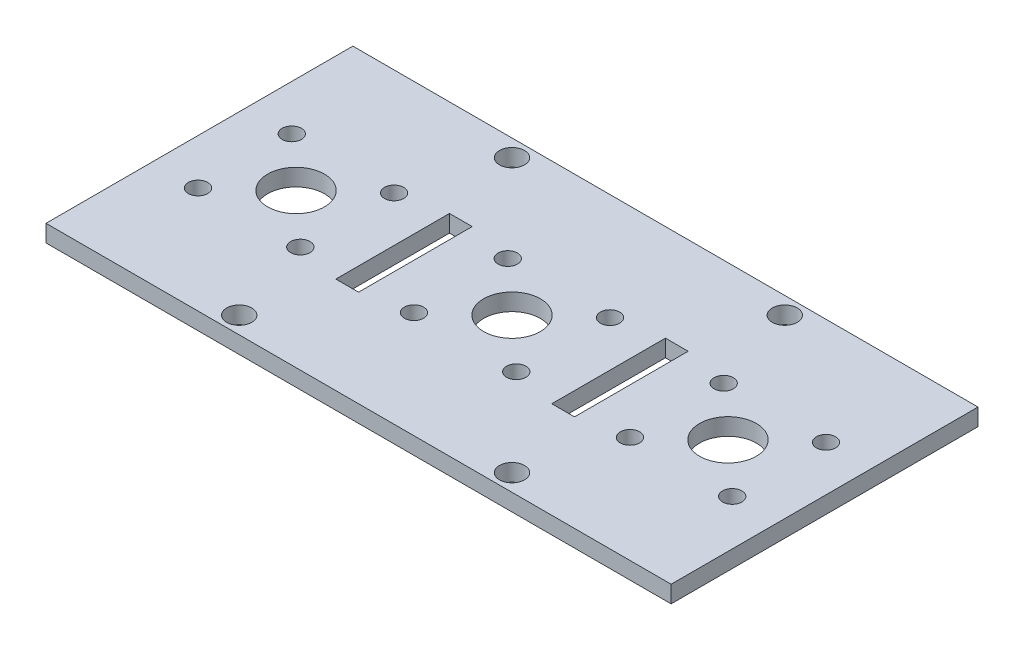
ISO-10303-21;
HEADER;
FILE_DESCRIPTION(('STEP AP214'),'2;1');
FILE_NAME('part.step','',(''),(''),'','','');
FILE_SCHEMA(('AUTOMOTIVE_DESIGN { 1 0 10303 214 1 1 1 1 }'));
ENDSEC;
DATA;
#1=APPLICATION_CONTEXT('core data for automotive mechanical design processes');
#2=APPLICATION_PROTOCOL_DEFINITION('international standard','automotive_design',2000,#1);
#3=PRODUCT_CONTEXT('',#1,'mechanical');
#4=PRODUCT('Part','Part','',(#3));
#5=PRODUCT_RELATED_PRODUCT_CATEGORY('part','',(#4));
#6=PRODUCT_DEFINITION_FORMATION('','',#4);
#7=PRODUCT_DEFINITION_CONTEXT('part definition',#1,'design');
#8=PRODUCT_DEFINITION('design','',#6,#7);
#9=PRODUCT_DEFINITION_SHAPE('','',#8);
#10=(LENGTH_UNIT() NAMED_UNIT(*) SI_UNIT(.MILLI.,.METRE.));
#11=(NAMED_UNIT(*) PLANE_ANGLE_UNIT() SI_UNIT($,.RADIAN.));
#12=(NAMED_UNIT(*) SI_UNIT($,.STERADIAN.) SOLID_ANGLE_UNIT());
#13=UNCERTAINTY_MEASURE_WITH_UNIT(LENGTH_MEASURE(1.E-05),#10,'distance_accuracy_value','');
#14=(GEOMETRIC_REPRESENTATION_CONTEXT(3) GLOBAL_UNCERTAINTY_ASSIGNED_CONTEXT((#13)) GLOBAL_UNIT_ASSIGNED_CONTEXT((#10,
#11,#12)) REPRESENTATION_CONTEXT('',''));
#15=CARTESIAN_POINT('',(0.,0.,0.));
#16=DIRECTION('',(0.,0.,1.));
#17=DIRECTION('',(1.,0.,0.));
#18=AXIS2_PLACEMENT_3D('',#15,#16,#17);
#19=CARTESIAN_POINT('',(0.,-54.75,0.));
#20=DIRECTION('',(0.,1.,0.));
#21=DIRECTION('',(-1.,0.,0.));
#22=AXIS2_PLACEMENT_3D('',#19,#20,#21);
#23=PLANE('',#22);
#24=CARTESIAN_POINT('',(-8.99999999999999,-54.75,-68.25));
#25=DIRECTION('',(0.,1.,0.));
#26=DIRECTION('',(-1.,0.,0.));
#27=AXIS2_PLACEMENT_3D('',#24,#25,#26);
#28=CIRCLE('',#27,1.7);
#29=CARTESIAN_POINT('',(-10.7,-54.75,-68.25));
#30=VERTEX_POINT('',#29);
#31=EDGE_CURVE('E233',#30,#30,#28,.T.);
#32=ORIENTED_EDGE('',*,*,#31,.T.);
#33=EDGE_LOOP('',(#32));
#34=FACE_BOUND('',#33,.T.);
#35=CARTESIAN_POINT('',(9.,-54.75,-68.25));
#36=DIRECTION('',(0.,1.,0.));
#37=DIRECTION('',(1.,0.,0.));
#38=AXIS2_PLACEMENT_3D('',#35,#36,#37);
#39=CIRCLE('',#38,1.70000000000001);
#40=CARTESIAN_POINT('',(10.7,-54.75,-68.25));
#41=VERTEX_POINT('',#40);
#42=EDGE_CURVE('E241',#41,#41,#39,.T.);
#43=ORIENTED_EDGE('',*,*,#42,.T.);
#44=EDGE_LOOP('',(#43));
#45=FACE_BOUND('',#44,.T.);
#46=CARTESIAN_POINT('',(-8.99999999999999,-54.75,-51.75));
#47=DIRECTION('',(0.,1.,0.));
#48=DIRECTION('',(1.,0.,0.));
#49=AXIS2_PLACEMENT_3D('',#46,#47,#48);
#50=CIRCLE('',#49,1.7);
#51=CARTESIAN_POINT('',(-7.29999999999998,-54.75,-51.75));
#52=VERTEX_POINT('',#51);
#53=EDGE_CURVE('E249',#52,#52,#50,.T.);
#54=ORIENTED_EDGE('',*,*,#53,.T.);
#55=EDGE_LOOP('',(#54));
#56=FACE_BOUND('',#55,.T.);
#57=CARTESIAN_POINT('',(9.,-54.75,-51.75));
#58=DIRECTION('',(0.,1.,0.));
#59=DIRECTION('',(-1.,0.,0.));
#60=AXIS2_PLACEMENT_3D('',#57,#58,#59);
#61=CIRCLE('',#60,1.70000000000001);
#62=CARTESIAN_POINT('',(7.3,-54.75,-51.75));
#63=VERTEX_POINT('',#62);
#64=EDGE_CURVE('E165',#63,#63,#61,.T.);
#65=ORIENTED_EDGE('',*,*,#64,.T.);
#66=EDGE_LOOP('',(#65));
#67=FACE_BOUND('',#66,.T.);
#68=DIRECTION('',(1.,0.,0.));
#69=VECTOR('',#68,1.);
#70=CARTESIAN_POINT('',(-17.,-54.75,-50.));
#71=LINE('',#70,#69);
#72=CARTESIAN_POINT('',(-21.,-54.75,-50.));
#73=VERTEX_POINT('',#72);
#74=CARTESIAN_POINT('',(-17.,-54.75,-50.));
#75=VERTEX_POINT('',#74);
#76=EDGE_CURVE('E175',#73,#75,#71,.T.);
#77=ORIENTED_EDGE('',*,*,#76,.T.);
#78=DIRECTION('',(0.,0.,-1.));
#79=VECTOR('',#78,1.);
#80=CARTESIAN_POINT('',(-17.,-54.75,-50.));
#81=LINE('',#80,#79);
#82=CARTESIAN_POINT('',(-17.,-54.75,-70.));
#83=VERTEX_POINT('',#82);
#84=EDGE_CURVE('E142',#75,#83,#81,.T.);
#85=ORIENTED_EDGE('',*,*,#84,.T.);
#86=DIRECTION('',(-1.,0.,0.));
#87=VECTOR('',#86,1.);
#88=CARTESIAN_POINT('',(-17.,-54.75,-70.));
#89=LINE('',#88,#87);
#90=CARTESIAN_POINT('',(-21.,-54.75,-70.));
#91=VERTEX_POINT('',#90);
#92=EDGE_CURVE('E181',#83,#91,#89,.T.);
#93=ORIENTED_EDGE('',*,*,#92,.T.);
#94=DIRECTION('',(0.,0.,1.));
#95=VECTOR('',#94,1.);
#96=CARTESIAN_POINT('',(-21.,-54.75,-50.));
#97=LINE('',#96,#95);
#98=EDGE_CURVE('E62',#91,#73,#97,.T.);
#99=ORIENTED_EDGE('',*,*,#98,.T.);
#100=EDGE_LOOP('',(#77,#85,#93,#99));
#101=FACE_BOUND('',#100,.T.);
#102=DIRECTION('',(0.,0.,1.));
#103=VECTOR('',#102,1.);
#104=CARTESIAN_POINT('',(17.,-54.75,-50.));
#105=LINE('',#104,#103);
#106=CARTESIAN_POINT('',(17.,-54.75,-70.));
#107=VERTEX_POINT('',#106);
#108=CARTESIAN_POINT('',(17.,-54.75,-50.));
#109=VERTEX_POINT('',#108);
#110=EDGE_CURVE('E191',#107,#109,#105,.T.);
#111=ORIENTED_EDGE('',*,*,#110,.T.);
#112=DIRECTION('',(1.,0.,0.));
#113=VECTOR('',#112,1.);
#114=CARTESIAN_POINT('',(17.,-54.75,-50.));
#115=LINE('',#114,#113);
#116=CARTESIAN_POINT('',(21.,-54.75,-50.));
#117=VERTEX_POINT('',#116);
#118=EDGE_CURVE('E206',#109,#117,#115,.T.);
#119=ORIENTED_EDGE('',*,*,#118,.T.);
#120=DIRECTION('',(0.,0.,-1.));
#121=VECTOR('',#120,1.);
#122=CARTESIAN_POINT('',(21.,-54.75,-50.));
#123=LINE('',#122,#121);
#124=CARTESIAN_POINT('',(21.,-54.75,-70.));
#125=VERTEX_POINT('',#124);
#126=EDGE_CURVE('E221',#117,#125,#123,.T.);
#127=ORIENTED_EDGE('',*,*,#126,.T.);
#128=DIRECTION('',(-1.,0.,0.));
#129=VECTOR('',#128,1.);
#130=CARTESIAN_POINT('',(17.,-54.75,-70.));
#131=LINE('',#130,#129);
#132=EDGE_CURVE('E70',#125,#107,#131,.T.);
#133=ORIENTED_EDGE('',*,*,#132,.T.);
#134=EDGE_LOOP('',(#111,#119,#127,#133));
#135=FACE_BOUND('',#134,.T.);
#136=CARTESIAN_POINT('',(0.,-54.75,-60.));
#137=DIRECTION('',(0.,1.,0.));
#138=DIRECTION('',(-1.,0.,0.));
#139=AXIS2_PLACEMENT_3D('',#136,#137,#138);
#140=CIRCLE('',#139,5.);
#141=CARTESIAN_POINT('',(-4.99999999999999,-54.75,-60.));
#142=VERTEX_POINT('',#141);
#143=EDGE_CURVE('E256',#142,#142,#140,.T.);
#144=ORIENTED_EDGE('',*,*,#143,.T.);
#145=EDGE_LOOP('',(#144));
#146=FACE_BOUND('',#145,.T.);
#147=CARTESIAN_POINT('',(29.0000000000001,-54.75,-68.25));
#148=DIRECTION('',(0.,1.,0.));
#149=DIRECTION('',(-1.,0.,0.));
#150=AXIS2_PLACEMENT_3D('',#147,#148,#149);
#151=CIRCLE('',#150,1.7);
#152=CARTESIAN_POINT('',(27.3000000000001,-54.75,-68.25));
#153=VERTEX_POINT('',#152);
#154=EDGE_CURVE('E317',#153,#153,#151,.F.);
#155=ORIENTED_EDGE('',*,*,#154,.F.);
#156=EDGE_LOOP('',(#155));
#157=FACE_BOUND('',#156,.T.);
#158=CARTESIAN_POINT('',(47.,-54.75,-68.25));
#159=DIRECTION('',(0.,1.,0.));
#160=DIRECTION('',(-1.,0.,0.));
#161=AXIS2_PLACEMENT_3D('',#158,#159,#160);
#162=CIRCLE('',#161,1.7);
#163=CARTESIAN_POINT('',(45.3,-54.75,-68.25));
#164=VERTEX_POINT('',#163);
#165=EDGE_CURVE('E337',#164,#164,#162,.F.);
#166=ORIENTED_EDGE('',*,*,#165,.F.);
#167=EDGE_LOOP('',(#166));
#168=FACE_BOUND('',#167,.T.);
#169=CARTESIAN_POINT('',(47.,-54.75,-51.75));
#170=DIRECTION('',(0.,1.,0.));
#171=DIRECTION('',(-1.,0.,0.));
#172=AXIS2_PLACEMENT_3D('',#169,#170,#171);
#173=CIRCLE('',#172,1.7);
#174=CARTESIAN_POINT('',(45.3,-54.75,-51.75));
#175=VERTEX_POINT('',#174);
#176=EDGE_CURVE('E333',#175,#175,#173,.T.);
#177=ORIENTED_EDGE('',*,*,#176,.T.);
#178=EDGE_LOOP('',(#177));
#179=FACE_BOUND('',#178,.T.);
#180=CARTESIAN_POINT('',(-47.,-54.75,-51.75));
#181=DIRECTION('',(0.,1.,0.));
#182=DIRECTION('',(-1.,0.,0.));
#183=AXIS2_PLACEMENT_3D('',#180,#181,#182);
#184=CIRCLE('',#183,1.7);
#185=CARTESIAN_POINT('',(-48.7,-54.75,-51.75));
#186=VERTEX_POINT('',#185);
#187=EDGE_CURVE('E369',#186,#186,#184,.F.);
#188=ORIENTED_EDGE('',*,*,#187,.F.);
#189=EDGE_LOOP('',(#188));
#190=FACE_BOUND('',#189,.T.);
#191=CARTESIAN_POINT('',(-47.,-54.75,-68.25));
#192=DIRECTION('',(0.,1.,0.));
#193=DIRECTION('',(-1.,0.,0.));
#194=AXIS2_PLACEMENT_3D('',#191,#192,#193);
#195=CIRCLE('',#194,1.7);
#196=CARTESIAN_POINT('',(-48.7,-54.75,-68.25));
#197=VERTEX_POINT('',#196);
#198=EDGE_CURVE('E365',#197,#197,#195,.T.);
#199=ORIENTED_EDGE('',*,*,#198,.T.);
#200=EDGE_LOOP('',(#199));
#201=FACE_BOUND('',#200,.T.);
#202=CARTESIAN_POINT('',(-24.,-54.75,-84.));
#203=DIRECTION('',(0.,1.,0.));
#204=DIRECTION('',(-1.,0.,0.));
#205=AXIS2_PLACEMENT_3D('',#202,#203,#204);
#206=CIRCLE('',#205,2.2);
#207=CARTESIAN_POINT('',(-26.2,-54.75,-84.));
#208=VERTEX_POINT('',#207);
#209=EDGE_CURVE('E55',#208,#208,#206,.T.);
#210=ORIENTED_EDGE('',*,*,#209,.T.);
#211=EDGE_LOOP('',(#210));
#212=FACE_BOUND('',#211,.T.);
#213=CARTESIAN_POINT('',(24.,-54.75,-84.));
#214=DIRECTION('',(0.,1.,0.));
#215=DIRECTION('',(-1.,0.,0.));
#216=AXIS2_PLACEMENT_3D('',#213,#214,#215);
#217=CIRCLE('',#216,2.2);
#218=CARTESIAN_POINT('',(21.8,-54.75,-84.));
#219=VERTEX_POINT('',#218);
#220=EDGE_CURVE('E11',#219,#219,#217,.T.);
#221=ORIENTED_EDGE('',*,*,#220,.T.);
#222=EDGE_LOOP('',(#221));
#223=FACE_BOUND('',#222,.T.);
#224=CARTESIAN_POINT('',(24.,-54.75,-36.));
#225=DIRECTION('',(0.,1.,0.));
#226=DIRECTION('',(-1.,0.,0.));
#227=AXIS2_PLACEMENT_3D('',#224,#225,#226);
#228=CIRCLE('',#227,2.2);
#229=CARTESIAN_POINT('',(21.8,-54.75,-36.));
#230=VERTEX_POINT('',#229);
#231=EDGE_CURVE('E392',#230,#230,#228,.T.);
#232=ORIENTED_EDGE('',*,*,#231,.T.);
#233=EDGE_LOOP('',(#232));
#234=FACE_BOUND('',#233,.T.);
#235=CARTESIAN_POINT('',(-24.,-54.75,-36.));
#236=DIRECTION('',(0.,1.,0.));
#237=DIRECTION('',(-1.,0.,0.));
#238=AXIS2_PLACEMENT_3D('',#235,#236,#237);
#239=CIRCLE('',#238,2.2);
#240=CARTESIAN_POINT('',(-26.2,-54.75,-36.));
#241=VERTEX_POINT('',#240);
#242=EDGE_CURVE('E399',#241,#241,#239,.T.);
#243=ORIENTED_EDGE('',*,*,#242,.T.);
#244=EDGE_LOOP('',(#243));
#245=FACE_BOUND('',#244,.T.);
#246=DIRECTION('',(0.,0.,1.));
#247=VECTOR('',#246,1.);
#248=CARTESIAN_POINT('',(55.,-54.75,0.));
#249=LINE('',#248,#247);
#250=CARTESIAN_POINT('',(55.,-54.7500000000001,-87.));
#251=VERTEX_POINT('',#250);
#252=CARTESIAN_POINT('',(55.,-54.75,-33.));
#253=VERTEX_POINT('',#252);
#254=EDGE_CURVE('E324',#251,#253,#249,.T.);
#255=ORIENTED_EDGE('',*,*,#254,.T.);
#256=DIRECTION('',(-1.,0.,0.));
#257=VECTOR('',#256,1.);
#258=CARTESIAN_POINT('',(0.,-54.7500000000001,-33.));
#259=LINE('',#258,#257);
#260=CARTESIAN_POINT('',(-55.,-54.7500000000001,-33.));
#261=VERTEX_POINT('',#260);
#262=EDGE_CURVE('E264',#253,#261,#259,.T.);
#263=ORIENTED_EDGE('',*,*,#262,.T.);
#264=DIRECTION('',(0.,0.,1.));
#265=VECTOR('',#264,1.);
#266=CARTESIAN_POINT('',(-55.,-54.75,0.));
#267=LINE('',#266,#265);
#268=CARTESIAN_POINT('',(-55.,-54.7500000000001,-87.));
#269=VERTEX_POINT('',#268);
#270=EDGE_CURVE('E356',#269,#261,#267,.T.);
#271=ORIENTED_EDGE('',*,*,#270,.F.);
#272=DIRECTION('',(1.,0.,0.));
#273=VECTOR('',#272,1.);
#274=CARTESIAN_POINT('',(0.,-54.7500000000001,-87.));
#275=LINE('',#274,#273);
#276=EDGE_CURVE('E280',#269,#251,#275,.T.);
#277=ORIENTED_EDGE('',*,*,#276,.T.);
#278=EDGE_LOOP('',(#255,#263,#271,#277));
#279=FACE_BOUND('',#278,.T.);
#280=CARTESIAN_POINT('',(-38.,-54.75,-60.));
#281=DIRECTION('',(0.,1.,0.));
#282=DIRECTION('',(-1.,0.,0.));
#283=AXIS2_PLACEMENT_3D('',#280,#281,#282);
#284=CIRCLE('',#283,5.);
#285=CARTESIAN_POINT('',(-43.,-54.75,-60.));
#286=VERTEX_POINT('',#285);
#287=EDGE_CURVE('E360',#286,#286,#284,.F.);
#288=ORIENTED_EDGE('',*,*,#287,.F.);
#289=EDGE_LOOP('',(#288));
#290=FACE_BOUND('',#289,.T.);
#291=CARTESIAN_POINT('',(-29.0000000000001,-54.7500000000001,-68.25));
#292=DIRECTION('',(0.,1.,0.));
#293=DIRECTION('',(-1.,0.,0.));
#294=AXIS2_PLACEMENT_3D('',#291,#292,#293);
#295=CIRCLE('',#294,1.7);
#296=CARTESIAN_POINT('',(-30.7000000000001,-54.7500000000001,-68.25));
#297=VERTEX_POINT('',#296);
#298=EDGE_CURVE('E300',#297,#297,#295,.T.);
#299=ORIENTED_EDGE('',*,*,#298,.T.);
#300=EDGE_LOOP('',(#299));
#301=FACE_BOUND('',#300,.T.);
#302=CARTESIAN_POINT('',(-29.,-54.7500000000001,-51.75));
#303=DIRECTION('',(0.,1.,0.));
#304=DIRECTION('',(-1.,0.,0.));
#305=AXIS2_PLACEMENT_3D('',#302,#303,#304);
#306=CIRCLE('',#305,1.7);
#307=CARTESIAN_POINT('',(-30.7,-54.7500000000001,-51.75));
#308=VERTEX_POINT('',#307);
#309=EDGE_CURVE('E309',#308,#308,#306,.T.);
#310=ORIENTED_EDGE('',*,*,#309,.T.);
#311=EDGE_LOOP('',(#310));
#312=FACE_BOUND('',#311,.T.);
#313=CARTESIAN_POINT('',(38.,-54.75,-60.));
#314=DIRECTION('',(0.,1.,0.));
#315=DIRECTION('',(-1.,0.,0.));
#316=AXIS2_PLACEMENT_3D('',#313,#314,#315);
#317=CIRCLE('',#316,5.);
#318=CARTESIAN_POINT('',(33.,-54.75,-60.));
#319=VERTEX_POINT('',#318);
#320=EDGE_CURVE('E328',#319,#319,#317,.T.);
#321=ORIENTED_EDGE('',*,*,#320,.T.);
#322=EDGE_LOOP('',(#321));
#323=FACE_BOUND('',#322,.T.);
#324=CARTESIAN_POINT('',(29.,-54.75,-51.75));
#325=DIRECTION('',(0.,1.,0.));
#326=DIRECTION('',(-1.,0.,0.));
#327=AXIS2_PLACEMENT_3D('',#324,#325,#326);
#328=CIRCLE('',#327,1.7);
#329=CARTESIAN_POINT('',(27.3,-54.75,-51.75));
#330=VERTEX_POINT('',#329);
#331=EDGE_CURVE('E292',#330,#330,#328,.F.);
#332=ORIENTED_EDGE('',*,*,#331,.F.);
#333=EDGE_LOOP('',(#332));
#334=FACE_BOUND('',#333,.T.);
#335=ADVANCED_FACE('F47',(#34,#45,#56,#67,#101,#135,#146,#157,#168,#179,#190,#201,#212,#223,
#234,#245,#279,#290,#301,#312,#323,#334),#23,.F.);
#336=CARTESIAN_POINT('',(0.,-51.75,0.));
#337=DIRECTION('',(0.,1.,0.));
#338=DIRECTION('',(-1.,0.,0.));
#339=AXIS2_PLACEMENT_3D('',#336,#337,#338);
#340=PLANE('',#339);
#341=CARTESIAN_POINT('',(-8.99999999999999,-51.75,-68.25));
#342=DIRECTION('',(0.,1.,0.));
#343=DIRECTION('',(-1.,0.,0.));
#344=AXIS2_PLACEMENT_3D('',#341,#342,#343);
#345=CIRCLE('',#344,1.7);
#346=CARTESIAN_POINT('',(-10.7,-51.75,-68.25));
#347=VERTEX_POINT('',#346);
#348=EDGE_CURVE('E228',#347,#347,#345,.T.);
#349=ORIENTED_EDGE('',*,*,#348,.F.);
#350=EDGE_LOOP('',(#349));
#351=FACE_BOUND('',#350,.T.);
#352=CARTESIAN_POINT('',(9.,-51.75,-68.25));
#353=DIRECTION('',(0.,1.,0.));
#354=DIRECTION('',(1.,0.,0.));
#355=AXIS2_PLACEMENT_3D('',#352,#353,#354);
#356=CIRCLE('',#355,1.70000000000001);
#357=CARTESIAN_POINT('',(10.7,-51.75,-68.25));
#358=VERTEX_POINT('',#357);
#359=EDGE_CURVE('E237',#358,#358,#356,.T.);
#360=ORIENTED_EDGE('',*,*,#359,.F.);
#361=EDGE_LOOP('',(#360));
#362=FACE_BOUND('',#361,.T.);
#363=CARTESIAN_POINT('',(-8.99999999999999,-51.75,-51.75));
#364=DIRECTION('',(0.,1.,0.));
#365=DIRECTION('',(1.,0.,0.));
#366=AXIS2_PLACEMENT_3D('',#363,#364,#365);
#367=CIRCLE('',#366,1.7);
#368=CARTESIAN_POINT('',(-7.29999999999998,-51.75,-51.75));
#369=VERTEX_POINT('',#368);
#370=EDGE_CURVE('E245',#369,#369,#367,.T.);
#371=ORIENTED_EDGE('',*,*,#370,.F.);
#372=EDGE_LOOP('',(#371));
#373=FACE_BOUND('',#372,.T.);
#374=CARTESIAN_POINT('',(9.,-51.75,-51.75));
#375=DIRECTION('',(0.,1.,0.));
#376=DIRECTION('',(-1.,0.,0.));
#377=AXIS2_PLACEMENT_3D('',#374,#375,#376);
#378=CIRCLE('',#377,1.70000000000001);
#379=CARTESIAN_POINT('',(7.3,-51.75,-51.75));
#380=VERTEX_POINT('',#379);
#381=EDGE_CURVE('E170',#380,#380,#378,.T.);
#382=ORIENTED_EDGE('',*,*,#381,.F.);
#383=EDGE_LOOP('',(#382));
#384=FACE_BOUND('',#383,.T.);
#385=DIRECTION('',(0.,0.,-1.));
#386=VECTOR('',#385,1.);
#387=CARTESIAN_POINT('',(-17.,-51.75,-50.));
#388=LINE('',#387,#386);
#389=CARTESIAN_POINT('',(-17.,-51.75,-50.));
#390=VERTEX_POINT('',#389);
#391=CARTESIAN_POINT('',(-17.,-51.75,-70.));
#392=VERTEX_POINT('',#391);
#393=EDGE_CURVE('E139',#390,#392,#388,.T.);
#394=ORIENTED_EDGE('',*,*,#393,.F.);
#395=DIRECTION('',(1.,0.,0.));
#396=VECTOR('',#395,1.);
#397=CARTESIAN_POINT('',(-17.,-51.75,-50.));
#398=LINE('',#397,#396);
#399=CARTESIAN_POINT('',(-21.,-51.75,-50.));
#400=VERTEX_POINT('',#399);
#401=EDGE_CURVE('E151',#400,#390,#398,.T.);
#402=ORIENTED_EDGE('',*,*,#401,.F.);
#403=DIRECTION('',(0.,0.,1.));
#404=VECTOR('',#403,1.);
#405=CARTESIAN_POINT('',(-21.,-51.75,-50.));
#406=LINE('',#405,#404);
#407=CARTESIAN_POINT('',(-21.,-51.75,-70.));
#408=VERTEX_POINT('',#407);
#409=EDGE_CURVE('E157',#408,#400,#406,.T.);
#410=ORIENTED_EDGE('',*,*,#409,.F.);
#411=DIRECTION('',(-1.,0.,0.));
#412=VECTOR('',#411,1.);
#413=CARTESIAN_POINT('',(-17.,-51.75,-70.));
#414=LINE('',#413,#412);
#415=EDGE_CURVE('E163',#392,#408,#414,.T.);
#416=ORIENTED_EDGE('',*,*,#415,.F.);
#417=EDGE_LOOP('',(#394,#402,#410,#416));
#418=FACE_BOUND('',#417,.T.);
#419=DIRECTION('',(1.,0.,0.));
#420=VECTOR('',#419,1.);
#421=CARTESIAN_POINT('',(17.,-51.75,-50.));
#422=LINE('',#421,#420);
#423=CARTESIAN_POINT('',(17.,-51.75,-50.));
#424=VERTEX_POINT('',#423);
#425=CARTESIAN_POINT('',(21.,-51.75,-50.));
#426=VERTEX_POINT('',#425);
#427=EDGE_CURVE('E148',#424,#426,#422,.T.);
#428=ORIENTED_EDGE('',*,*,#427,.F.);
#429=DIRECTION('',(0.,0.,1.));
#430=VECTOR('',#429,1.);
#431=CARTESIAN_POINT('',(17.,-51.75,-50.));
#432=LINE('',#431,#430);
#433=CARTESIAN_POINT('',(17.,-51.75,-70.));
#434=VERTEX_POINT('',#433);
#435=EDGE_CURVE('E201',#434,#424,#432,.T.);
#436=ORIENTED_EDGE('',*,*,#435,.F.);
#437=DIRECTION('',(-1.,0.,0.));
#438=VECTOR('',#437,1.);
#439=CARTESIAN_POINT('',(17.,-51.75,-70.));
#440=LINE('',#439,#438);
#441=CARTESIAN_POINT('',(21.,-51.75,-70.));
#442=VERTEX_POINT('',#441);
#443=EDGE_CURVE('E205',#442,#434,#440,.T.);
#444=ORIENTED_EDGE('',*,*,#443,.F.);
#445=DIRECTION('',(0.,0.,-1.));
#446=VECTOR('',#445,1.);
#447=CARTESIAN_POINT('',(21.,-51.75,-50.));
#448=LINE('',#447,#446);
#449=EDGE_CURVE('E210',#426,#442,#448,.T.);
#450=ORIENTED_EDGE('',*,*,#449,.F.);
#451=EDGE_LOOP('',(#428,#436,#444,#450));
#452=FACE_BOUND('',#451,.T.);
#453=CARTESIAN_POINT('',(0.,-51.75,-60.));
#454=DIRECTION('',(0.,1.,0.));
#455=DIRECTION('',(-1.,0.,0.));
#456=AXIS2_PLACEMENT_3D('',#453,#454,#455);
#457=CIRCLE('',#456,5.);
#458=CARTESIAN_POINT('',(-4.99999999999999,-51.75,-60.));
#459=VERTEX_POINT('',#458);
#460=EDGE_CURVE('E232',#459,#459,#457,.T.);
#461=ORIENTED_EDGE('',*,*,#460,.F.);
#462=EDGE_LOOP('',(#461));
#463=FACE_BOUND('',#462,.T.);
#464=DIRECTION('',(-1.,0.,0.));
#465=VECTOR('',#464,1.);
#466=CARTESIAN_POINT('',(0.,-51.75,-33.));
#467=LINE('',#466,#465);
#468=CARTESIAN_POINT('',(55.,-51.75,-33.));
#469=VERTEX_POINT('',#468);
#470=CARTESIAN_POINT('',(-55.,-51.75,-33.));
#471=VERTEX_POINT('',#470);
#472=EDGE_CURVE('E269',#469,#471,#467,.T.);
#473=ORIENTED_EDGE('',*,*,#472,.F.);
#474=DIRECTION('',(0.,0.,1.));
#475=VECTOR('',#474,1.);
#476=CARTESIAN_POINT('',(55.,-51.75,0.));
#477=LINE('',#476,#475);
#478=CARTESIAN_POINT('',(55.,-51.75,-87.));
#479=VERTEX_POINT('',#478);
#480=EDGE_CURVE('E304',#479,#469,#477,.T.);
#481=ORIENTED_EDGE('',*,*,#480,.F.);
#482=DIRECTION('',(1.,0.,0.));
#483=VECTOR('',#482,1.);
#484=CARTESIAN_POINT('',(0.,-51.75,-87.));
#485=LINE('',#484,#483);
#486=CARTESIAN_POINT('',(-55.,-51.75,-87.));
#487=VERTEX_POINT('',#486);
#488=EDGE_CURVE('E260',#487,#479,#485,.T.);
#489=ORIENTED_EDGE('',*,*,#488,.F.);
#490=DIRECTION('',(0.,0.,1.));
#491=VECTOR('',#490,1.);
#492=CARTESIAN_POINT('',(-55.,-51.75,0.));
#493=LINE('',#492,#491);
#494=EDGE_CURVE('E341',#487,#471,#493,.T.);
#495=ORIENTED_EDGE('',*,*,#494,.T.);
#496=EDGE_LOOP('',(#473,#481,#489,#495));
#497=FACE_BOUND('',#496,.T.);
#498=CARTESIAN_POINT('',(-38.,-51.75,-60.));
#499=DIRECTION('',(0.,1.,0.));
#500=DIRECTION('',(-1.,0.,0.));
#501=AXIS2_PLACEMENT_3D('',#498,#499,#500);
#502=CIRCLE('',#501,5.);
#503=CARTESIAN_POINT('',(-43.,-51.75,-60.));
#504=VERTEX_POINT('',#503);
#505=EDGE_CURVE('E377',#504,#504,#502,.F.);
#506=ORIENTED_EDGE('',*,*,#505,.T.);
#507=EDGE_LOOP('',(#506));
#508=FACE_BOUND('',#507,.T.);
#509=CARTESIAN_POINT('',(38.,-51.75,-60.));
#510=DIRECTION('',(0.,1.,0.));
#511=DIRECTION('',(-1.,0.,0.));
#512=AXIS2_PLACEMENT_3D('',#509,#510,#511);
#513=CIRCLE('',#512,5.);
#514=CARTESIAN_POINT('',(33.,-51.75,-60.));
#515=VERTEX_POINT('',#514);
#516=EDGE_CURVE('E345',#515,#515,#513,.T.);
#517=ORIENTED_EDGE('',*,*,#516,.F.);
#518=EDGE_LOOP('',(#517));
#519=FACE_BOUND('',#518,.T.);
#520=CARTESIAN_POINT('',(29.0000000000001,-51.75,-68.25));
#521=DIRECTION('',(0.,1.,0.));
#522=DIRECTION('',(-1.,0.,0.));
#523=AXIS2_PLACEMENT_3D('',#520,#521,#522);
#524=CIRCLE('',#523,1.7);
#525=CARTESIAN_POINT('',(27.3000000000001,-51.75,-68.25));
#526=VERTEX_POINT('',#525);
#527=EDGE_CURVE('E296',#526,#526,#524,.F.);
#528=ORIENTED_EDGE('',*,*,#527,.T.);
#529=EDGE_LOOP('',(#528));
#530=FACE_BOUND('',#529,.T.);
#531=CARTESIAN_POINT('',(-29.,-51.75,-51.75));
#532=DIRECTION('',(0.,1.,0.));
#533=DIRECTION('',(-1.,0.,0.));
#534=AXIS2_PLACEMENT_3D('',#531,#532,#533);
#535=CIRCLE('',#534,1.7);
#536=CARTESIAN_POINT('',(-30.7,-51.75,-51.75));
#537=VERTEX_POINT('',#536);
#538=EDGE_CURVE('E313',#537,#537,#535,.T.);
#539=ORIENTED_EDGE('',*,*,#538,.F.);
#540=EDGE_LOOP('',(#539));
#541=FACE_BOUND('',#540,.T.);
#542=CARTESIAN_POINT('',(-29.0000000000001,-51.75,-68.25));
#543=DIRECTION('',(0.,1.,0.));
#544=DIRECTION('',(-1.,0.,0.));
#545=AXIS2_PLACEMENT_3D('',#542,#543,#544);
#546=CIRCLE('',#545,1.7);
#547=CARTESIAN_POINT('',(-30.7000000000001,-51.75,-68.25));
#548=VERTEX_POINT('',#547);
#549=EDGE_CURVE('E305',#548,#548,#546,.T.);
#550=ORIENTED_EDGE('',*,*,#549,.F.);
#551=EDGE_LOOP('',(#550));
#552=FACE_BOUND('',#551,.T.);
#553=CARTESIAN_POINT('',(-24.,-51.75,-36.));
#554=DIRECTION('',(0.,1.,0.));
#555=DIRECTION('',(-1.,0.,0.));
#556=AXIS2_PLACEMENT_3D('',#553,#554,#555);
#557=CIRCLE('',#556,2.2);
#558=CARTESIAN_POINT('',(-26.2,-51.75,-36.));
#559=VERTEX_POINT('',#558);
#560=EDGE_CURVE('E388',#559,#559,#557,.T.);
#561=ORIENTED_EDGE('',*,*,#560,.F.);
#562=EDGE_LOOP('',(#561));
#563=FACE_BOUND('',#562,.T.);
#564=CARTESIAN_POINT('',(24.,-51.75,-36.));
#565=DIRECTION('',(0.,1.,0.));
#566=DIRECTION('',(-1.,0.,0.));
#567=AXIS2_PLACEMENT_3D('',#564,#565,#566);
#568=CIRCLE('',#567,2.2);
#569=CARTESIAN_POINT('',(21.8,-51.75,-36.));
#570=VERTEX_POINT('',#569);
#571=EDGE_CURVE('E373',#570,#570,#568,.T.);
#572=ORIENTED_EDGE('',*,*,#571,.F.);
#573=EDGE_LOOP('',(#572));
#574=FACE_BOUND('',#573,.T.);
#575=CARTESIAN_POINT('',(24.,-51.75,-84.));
#576=DIRECTION('',(0.,1.,0.));
#577=DIRECTION('',(1.,0.,0.));
#578=AXIS2_PLACEMENT_3D('',#575,#576,#577);
#579=CIRCLE('',#578,2.2);
#580=CARTESIAN_POINT('',(26.2,-51.75,-84.));
#581=VERTEX_POINT('',#580);
#582=EDGE_CURVE('E403',#581,#581,#579,.T.);
#583=ORIENTED_EDGE('',*,*,#582,.F.);
#584=EDGE_LOOP('',(#583));
#585=FACE_BOUND('',#584,.T.);
#586=CARTESIAN_POINT('',(-24.,-51.75,-84.));
#587=DIRECTION('',(0.,1.,0.));
#588=DIRECTION('',(-1.,0.,0.));
#589=AXIS2_PLACEMENT_3D('',#586,#587,#588);
#590=CIRCLE('',#589,2.2);
#591=CARTESIAN_POINT('',(-26.2,-51.75,-84.));
#592=VERTEX_POINT('',#591);
#593=EDGE_CURVE('E407',#592,#592,#590,.T.);
#594=ORIENTED_EDGE('',*,*,#593,.F.);
#595=EDGE_LOOP('',(#594));
#596=FACE_BOUND('',#595,.T.);
#597=CARTESIAN_POINT('',(-47.,-51.75,-68.25));
#598=DIRECTION('',(0.,1.,0.));
#599=DIRECTION('',(-1.,0.,0.));
#600=AXIS2_PLACEMENT_3D('',#597,#598,#599);
#601=CIRCLE('',#600,1.7);
#602=CARTESIAN_POINT('',(-48.7,-51.75,-68.25));
#603=VERTEX_POINT('',#602);
#604=EDGE_CURVE('E381',#603,#603,#601,.T.);
#605=ORIENTED_EDGE('',*,*,#604,.F.);
#606=EDGE_LOOP('',(#605));
#607=FACE_BOUND('',#606,.T.);
#608=CARTESIAN_POINT('',(-47.,-51.75,-51.75));
#609=DIRECTION('',(0.,1.,0.));
#610=DIRECTION('',(-1.,0.,0.));
#611=AXIS2_PLACEMENT_3D('',#608,#609,#610);
#612=CIRCLE('',#611,1.7);
#613=CARTESIAN_POINT('',(-48.7,-51.75,-51.75));
#614=VERTEX_POINT('',#613);
#615=EDGE_CURVE('E361',#614,#614,#612,.F.);
#616=ORIENTED_EDGE('',*,*,#615,.T.);
#617=EDGE_LOOP('',(#616));
#618=FACE_BOUND('',#617,.T.);
#619=CARTESIAN_POINT('',(47.,-51.75,-51.75));
#620=DIRECTION('',(0.,1.,0.));
#621=DIRECTION('',(-1.,0.,0.));
#622=AXIS2_PLACEMENT_3D('',#619,#620,#621);
#623=CIRCLE('',#622,1.7);
#624=CARTESIAN_POINT('',(45.3,-51.75,-51.75));
#625=VERTEX_POINT('',#624);
#626=EDGE_CURVE('E349',#625,#625,#623,.T.);
#627=ORIENTED_EDGE('',*,*,#626,.F.);
#628=EDGE_LOOP('',(#627));
#629=FACE_BOUND('',#628,.T.);
#630=CARTESIAN_POINT('',(47.,-51.75,-68.25));
#631=DIRECTION('',(0.,1.,0.));
#632=DIRECTION('',(-1.,0.,0.));
#633=AXIS2_PLACEMENT_3D('',#630,#631,#632);
#634=CIRCLE('',#633,1.7);
#635=CARTESIAN_POINT('',(45.3,-51.75,-68.25));
#636=VERTEX_POINT('',#635);
#637=EDGE_CURVE('E329',#636,#636,#634,.F.);
#638=ORIENTED_EDGE('',*,*,#637,.T.);
#639=EDGE_LOOP('',(#638));
#640=FACE_BOUND('',#639,.T.);
#641=CARTESIAN_POINT('',(29.,-51.75,-51.75));
#642=DIRECTION('',(0.,1.,0.));
#643=DIRECTION('',(-1.,0.,0.));
#644=AXIS2_PLACEMENT_3D('',#641,#642,#643);
#645=CIRCLE('',#644,1.7);
#646=CARTESIAN_POINT('',(27.3,-51.75,-51.75));
#647=VERTEX_POINT('',#646);
#648=EDGE_CURVE('E276',#647,#647,#645,.F.);
#649=ORIENTED_EDGE('',*,*,#648,.T.);
#650=EDGE_LOOP('',(#649));
#651=FACE_BOUND('',#650,.T.);
#652=ADVANCED_FACE('F160',(#351,#362,#373,#384,#418,#452,#463,#497,#508,#519,#530,#541,#552,
#563,#574,#585,#596,#607,#618,#629,#640,#651),#340,.T.);
#653=CARTESIAN_POINT('',(-24.,-104.75,-84.));
#654=DIRECTION('',(0.,1.,0.));
#655=DIRECTION('',(-1.,0.,0.));
#656=AXIS2_PLACEMENT_3D('',#653,#654,#655);
#657=CYLINDRICAL_SURFACE('',#656,2.2);
#658=ORIENTED_EDGE('',*,*,#593,.T.);
#659=EDGE_LOOP('',(#658));
#660=FACE_BOUND('',#659,.T.);
#661=ORIENTED_EDGE('',*,*,#209,.F.);
#662=EDGE_LOOP('',(#661));
#663=FACE_BOUND('',#662,.T.);
#664=ADVANCED_FACE('F416',(#660,#663),#657,.F.);
#665=CARTESIAN_POINT('',(24.,-104.75,-84.));
#666=DIRECTION('',(0.,1.,0.));
#667=DIRECTION('',(-1.,0.,0.));
#668=AXIS2_PLACEMENT_3D('',#665,#666,#667);
#669=CYLINDRICAL_SURFACE('',#668,2.2);
#670=ORIENTED_EDGE('',*,*,#582,.T.);
#671=EDGE_LOOP('',(#670));
#672=FACE_BOUND('',#671,.T.);
#673=ORIENTED_EDGE('',*,*,#220,.F.);
#674=EDGE_LOOP('',(#673));
#675=FACE_BOUND('',#674,.T.);
#676=ADVANCED_FACE('F418',(#672,#675),#669,.F.);
#677=CARTESIAN_POINT('',(24.,-104.75,-36.));
#678=DIRECTION('',(0.,1.,0.));
#679=DIRECTION('',(-1.,0.,0.));
#680=AXIS2_PLACEMENT_3D('',#677,#678,#679);
#681=CYLINDRICAL_SURFACE('',#680,2.2);
#682=ORIENTED_EDGE('',*,*,#571,.T.);
#683=EDGE_LOOP('',(#682));
#684=FACE_BOUND('',#683,.T.);
#685=ORIENTED_EDGE('',*,*,#231,.F.);
#686=EDGE_LOOP('',(#685));
#687=FACE_BOUND('',#686,.T.);
#688=ADVANCED_FACE('F424',(#684,#687),#681,.F.);
#689=CARTESIAN_POINT('',(-24.,-104.75,-36.));
#690=DIRECTION('',(0.,1.,0.));
#691=DIRECTION('',(-1.,0.,0.));
#692=AXIS2_PLACEMENT_3D('',#689,#690,#691);
#693=CYLINDRICAL_SURFACE('',#692,2.2);
#694=ORIENTED_EDGE('',*,*,#560,.T.);
#695=EDGE_LOOP('',(#694));
#696=FACE_BOUND('',#695,.T.);
#697=ORIENTED_EDGE('',*,*,#242,.F.);
#698=EDGE_LOOP('',(#697));
#699=FACE_BOUND('',#698,.T.);
#700=ADVANCED_FACE('F522',(#696,#699),#693,.F.);
#701=CARTESIAN_POINT('',(-38.,-54.75,-60.));
#702=DIRECTION('',(0.,1.,0.));
#703=DIRECTION('',(-1.,0.,0.));
#704=AXIS2_PLACEMENT_3D('',#701,#702,#703);
#705=CYLINDRICAL_SURFACE('',#704,5.);
#706=ORIENTED_EDGE('',*,*,#505,.F.);
#707=EDGE_LOOP('',(#706));
#708=FACE_BOUND('',#707,.T.);
#709=ORIENTED_EDGE('',*,*,#287,.T.);
#710=EDGE_LOOP('',(#709));
#711=FACE_BOUND('',#710,.T.);
#712=ADVANCED_FACE('F519',(#708,#711),#705,.F.);
#713=CARTESIAN_POINT('',(-55.,-54.75,0.));
#714=DIRECTION('',(-1.,0.,0.));
#715=DIRECTION('',(0.,0.,1.));
#716=AXIS2_PLACEMENT_3D('',#713,#714,#715);
#717=PLANE('',#716);
#718=DIRECTION('',(0.,1.,0.));
#719=VECTOR('',#718,1.);
#720=CARTESIAN_POINT('',(-55.,-54.7500000000001,-33.));
#721=LINE('',#720,#719);
#722=EDGE_CURVE('E268',#261,#471,#721,.T.);
#723=ORIENTED_EDGE('',*,*,#722,.T.);
#724=ORIENTED_EDGE('',*,*,#494,.F.);
#725=DIRECTION('',(0.,1.,0.));
#726=VECTOR('',#725,1.);
#727=CARTESIAN_POINT('',(-55.,-54.7500000000001,-87.));
#728=LINE('',#727,#726);
#729=EDGE_CURVE('E284',#269,#487,#728,.T.);
#730=ORIENTED_EDGE('',*,*,#729,.F.);
#731=ORIENTED_EDGE('',*,*,#270,.T.);
#732=EDGE_LOOP('',(#723,#724,#730,#731));
#733=FACE_BOUND('',#732,.T.);
#734=ADVANCED_FACE('F461',(#733),#717,.T.);
#735=CARTESIAN_POINT('',(-47.,-54.75,-68.25));
#736=DIRECTION('',(0.,1.,0.));
#737=DIRECTION('',(-1.,0.,0.));
#738=AXIS2_PLACEMENT_3D('',#735,#736,#737);
#739=CYLINDRICAL_SURFACE('',#738,1.7);
#740=ORIENTED_EDGE('',*,*,#198,.F.);
#741=EDGE_LOOP('',(#740));
#742=FACE_BOUND('',#741,.T.);
#743=ORIENTED_EDGE('',*,*,#604,.T.);
#744=EDGE_LOOP('',(#743));
#745=FACE_BOUND('',#744,.T.);
#746=ADVANCED_FACE('F457',(#742,#745),#739,.F.);
#747=CARTESIAN_POINT('',(-47.,-54.75,-51.75));
#748=DIRECTION('',(0.,1.,0.));
#749=DIRECTION('',(-1.,0.,0.));
#750=AXIS2_PLACEMENT_3D('',#747,#748,#749);
#751=CYLINDRICAL_SURFACE('',#750,1.7);
#752=ORIENTED_EDGE('',*,*,#187,.T.);
#753=EDGE_LOOP('',(#752));
#754=FACE_BOUND('',#753,.T.);
#755=ORIENTED_EDGE('',*,*,#615,.F.);
#756=EDGE_LOOP('',(#755));
#757=FACE_BOUND('',#756,.T.);
#758=ADVANCED_FACE('F460',(#754,#757),#751,.F.);
#759=CARTESIAN_POINT('',(55.,-54.75,0.));
#760=DIRECTION('',(-1.,0.,0.));
#761=DIRECTION('',(0.,0.,1.));
#762=AXIS2_PLACEMENT_3D('',#759,#760,#761);
#763=PLANE('',#762);
#764=ORIENTED_EDGE('',*,*,#480,.T.);
#765=DIRECTION('',(0.,1.,0.));
#766=VECTOR('',#765,1.);
#767=CARTESIAN_POINT('',(55.,-54.7500000000001,-33.));
#768=LINE('',#767,#766);
#769=EDGE_CURVE('E273',#253,#469,#768,.T.);
#770=ORIENTED_EDGE('',*,*,#769,.F.);
#771=ORIENTED_EDGE('',*,*,#254,.F.);
#772=DIRECTION('',(0.,1.,0.));
#773=VECTOR('',#772,1.);
#774=CARTESIAN_POINT('',(55.,-54.7500000000001,-87.));
#775=LINE('',#774,#773);
#776=EDGE_CURVE('E272',#251,#479,#775,.T.);
#777=ORIENTED_EDGE('',*,*,#776,.T.);
#778=EDGE_LOOP('',(#764,#770,#771,#777));
#779=FACE_BOUND('',#778,.T.);
#780=ADVANCED_FACE('F511',(#779),#763,.F.);
#781=CARTESIAN_POINT('',(38.,-54.75,-60.));
#782=DIRECTION('',(0.,1.,0.));
#783=DIRECTION('',(-1.,0.,0.));
#784=AXIS2_PLACEMENT_3D('',#781,#782,#783);
#785=CYLINDRICAL_SURFACE('',#784,5.);
#786=ORIENTED_EDGE('',*,*,#516,.T.);
#787=EDGE_LOOP('',(#786));
#788=FACE_BOUND('',#787,.T.);
#789=ORIENTED_EDGE('',*,*,#320,.F.);
#790=EDGE_LOOP('',(#789));
#791=FACE_BOUND('',#790,.T.);
#792=ADVANCED_FACE('F507',(#788,#791),#785,.F.);
#793=CARTESIAN_POINT('',(47.,-54.75,-51.75));
#794=DIRECTION('',(0.,1.,0.));
#795=DIRECTION('',(-1.,0.,0.));
#796=AXIS2_PLACEMENT_3D('',#793,#794,#795);
#797=CYLINDRICAL_SURFACE('',#796,1.7);
#798=ORIENTED_EDGE('',*,*,#176,.F.);
#799=EDGE_LOOP('',(#798));
#800=FACE_BOUND('',#799,.T.);
#801=ORIENTED_EDGE('',*,*,#626,.T.);
#802=EDGE_LOOP('',(#801));
#803=FACE_BOUND('',#802,.T.);
#804=ADVANCED_FACE('F503',(#800,#803),#797,.F.);
#805=CARTESIAN_POINT('',(47.,-54.75,-68.25));
#806=DIRECTION('',(0.,1.,0.));
#807=DIRECTION('',(-1.,0.,0.));
#808=AXIS2_PLACEMENT_3D('',#805,#806,#807);
#809=CYLINDRICAL_SURFACE('',#808,1.7);
#810=ORIENTED_EDGE('',*,*,#165,.T.);
#811=EDGE_LOOP('',(#810));
#812=FACE_BOUND('',#811,.T.);
#813=ORIENTED_EDGE('',*,*,#637,.F.);
#814=EDGE_LOOP('',(#813));
#815=FACE_BOUND('',#814,.T.);
#816=ADVANCED_FACE('F496',(#812,#815),#809,.F.);
#817=CARTESIAN_POINT('',(-29.0000000000001,-54.7500000000001,-68.25));
#818=DIRECTION('',(0.,1.,0.));
#819=DIRECTION('',(-1.,0.,0.));
#820=AXIS2_PLACEMENT_3D('',#817,#818,#819);
#821=CYLINDRICAL_SURFACE('',#820,1.7);
#822=ORIENTED_EDGE('',*,*,#298,.F.);
#823=EDGE_LOOP('',(#822));
#824=FACE_BOUND('',#823,.T.);
#825=ORIENTED_EDGE('',*,*,#549,.T.);
#826=EDGE_LOOP('',(#825));
#827=FACE_BOUND('',#826,.T.);
#828=ADVANCED_FACE('F493',(#824,#827),#821,.F.);
#829=CARTESIAN_POINT('',(-29.,-54.7500000000001,-51.75));
#830=DIRECTION('',(0.,1.,0.));
#831=DIRECTION('',(-1.,0.,0.));
#832=AXIS2_PLACEMENT_3D('',#829,#830,#831);
#833=CYLINDRICAL_SURFACE('',#832,1.7);
#834=ORIENTED_EDGE('',*,*,#309,.F.);
#835=EDGE_LOOP('',(#834));
#836=FACE_BOUND('',#835,.T.);
#837=ORIENTED_EDGE('',*,*,#538,.T.);
#838=EDGE_LOOP('',(#837));
#839=FACE_BOUND('',#838,.T.);
#840=ADVANCED_FACE('F488',(#836,#839),#833,.F.);
#841=CARTESIAN_POINT('',(29.0000000000001,-54.75,-68.25));
#842=DIRECTION('',(0.,1.,0.));
#843=DIRECTION('',(-1.,0.,0.));
#844=AXIS2_PLACEMENT_3D('',#841,#842,#843);
#845=CYLINDRICAL_SURFACE('',#844,1.7);
#846=ORIENTED_EDGE('',*,*,#154,.T.);
#847=EDGE_LOOP('',(#846));
#848=FACE_BOUND('',#847,.T.);
#849=ORIENTED_EDGE('',*,*,#527,.F.);
#850=EDGE_LOOP('',(#849));
#851=FACE_BOUND('',#850,.T.);
#852=ADVANCED_FACE('F477',(#848,#851),#845,.F.);
#853=CARTESIAN_POINT('',(29.,-54.75,-51.75));
#854=DIRECTION('',(0.,1.,0.));
#855=DIRECTION('',(-1.,0.,0.));
#856=AXIS2_PLACEMENT_3D('',#853,#854,#855);
#857=CYLINDRICAL_SURFACE('',#856,1.7);
#858=ORIENTED_EDGE('',*,*,#331,.T.);
#859=EDGE_LOOP('',(#858));
#860=FACE_BOUND('',#859,.T.);
#861=ORIENTED_EDGE('',*,*,#648,.F.);
#862=EDGE_LOOP('',(#861));
#863=FACE_BOUND('',#862,.T.);
#864=ADVANCED_FACE('F474',(#860,#863),#857,.F.);
#865=CARTESIAN_POINT('',(0.,-54.7500000000001,-87.));
#866=DIRECTION('',(0.,0.,1.));
#867=DIRECTION('',(0.,-1.,0.));
#868=AXIS2_PLACEMENT_3D('',#865,#866,#867);
#869=PLANE('',#868);
#870=ORIENTED_EDGE('',*,*,#488,.T.);
#871=ORIENTED_EDGE('',*,*,#776,.F.);
#872=ORIENTED_EDGE('',*,*,#276,.F.);
#873=ORIENTED_EDGE('',*,*,#729,.T.);
#874=EDGE_LOOP('',(#870,#871,#872,#873));
#875=FACE_BOUND('',#874,.T.);
#876=ADVANCED_FACE('F476',(#875),#869,.F.);
#877=CARTESIAN_POINT('',(0.,-54.7500000000001,-33.));
#878=DIRECTION('',(0.,0.,-1.));
#879=DIRECTION('',(-1.,0.,0.));
#880=AXIS2_PLACEMENT_3D('',#877,#878,#879);
#881=PLANE('',#880);
#882=ORIENTED_EDGE('',*,*,#472,.T.);
#883=ORIENTED_EDGE('',*,*,#722,.F.);
#884=ORIENTED_EDGE('',*,*,#262,.F.);
#885=ORIENTED_EDGE('',*,*,#769,.T.);
#886=EDGE_LOOP('',(#882,#883,#884,#885));
#887=FACE_BOUND('',#886,.T.);
#888=ADVANCED_FACE('F485',(#887),#881,.F.);
#889=CARTESIAN_POINT('',(0.,-54.75,-60.));
#890=DIRECTION('',(0.,1.,0.));
#891=DIRECTION('',(-1.,0.,0.));
#892=AXIS2_PLACEMENT_3D('',#889,#890,#891);
#893=CYLINDRICAL_SURFACE('',#892,5.);
#894=ORIENTED_EDGE('',*,*,#143,.F.);
#895=EDGE_LOOP('',(#894));
#896=FACE_BOUND('',#895,.T.);
#897=ORIENTED_EDGE('',*,*,#460,.T.);
#898=EDGE_LOOP('',(#897));
#899=FACE_BOUND('',#898,.T.);
#900=ADVANCED_FACE('F585',(#896,#899),#893,.F.);
#901=CARTESIAN_POINT('',(17.,-54.75,-50.));
#902=DIRECTION('',(0.,0.,1.));
#903=DIRECTION('',(1.,0.,0.));
#904=AXIS2_PLACEMENT_3D('',#901,#902,#903);
#905=PLANE('',#904);
#906=ORIENTED_EDGE('',*,*,#427,.T.);
#907=DIRECTION('',(0.,1.,0.));
#908=VECTOR('',#907,1.);
#909=CARTESIAN_POINT('',(21.,-54.75,-50.));
#910=LINE('',#909,#908);
#911=EDGE_CURVE('E187',#117,#426,#910,.T.);
#912=ORIENTED_EDGE('',*,*,#911,.F.);
#913=ORIENTED_EDGE('',*,*,#118,.F.);
#914=DIRECTION('',(0.,1.,0.));
#915=VECTOR('',#914,1.);
#916=CARTESIAN_POINT('',(17.,-54.75,-50.));
#917=LINE('',#916,#915);
#918=EDGE_CURVE('E198',#109,#424,#917,.T.);
#919=ORIENTED_EDGE('',*,*,#918,.T.);
#920=EDGE_LOOP('',(#906,#912,#913,#919));
#921=FACE_BOUND('',#920,.T.);
#922=ADVANCED_FACE('F589',(#921),#905,.F.);
#923=CARTESIAN_POINT('',(17.,-54.75,-50.));
#924=DIRECTION('',(-1.,0.,0.));
#925=DIRECTION('',(0.,-1.,0.));
#926=AXIS2_PLACEMENT_3D('',#923,#924,#925);
#927=PLANE('',#926);
#928=ORIENTED_EDGE('',*,*,#435,.T.);
#929=ORIENTED_EDGE('',*,*,#918,.F.);
#930=ORIENTED_EDGE('',*,*,#110,.F.);
#931=DIRECTION('',(0.,1.,0.));
#932=VECTOR('',#931,1.);
#933=CARTESIAN_POINT('',(17.,-54.75,-70.));
#934=LINE('',#933,#932);
#935=EDGE_CURVE('E195',#107,#434,#934,.T.);
#936=ORIENTED_EDGE('',*,*,#935,.T.);
#937=EDGE_LOOP('',(#928,#929,#930,#936));
#938=FACE_BOUND('',#937,.T.);
#939=ADVANCED_FACE('F610',(#938),#927,.F.);
#940=CARTESIAN_POINT('',(17.,-54.75,-70.));
#941=DIRECTION('',(0.,0.,-1.));
#942=DIRECTION('',(0.,1.,0.));
#943=AXIS2_PLACEMENT_3D('',#940,#941,#942);
#944=PLANE('',#943);
#945=ORIENTED_EDGE('',*,*,#443,.T.);
#946=ORIENTED_EDGE('',*,*,#935,.F.);
#947=ORIENTED_EDGE('',*,*,#132,.F.);
#948=DIRECTION('',(0.,1.,0.));
#949=VECTOR('',#948,1.);
#950=CARTESIAN_POINT('',(21.,-54.75,-70.));
#951=LINE('',#950,#949);
#952=EDGE_CURVE('E192',#125,#442,#951,.T.);
#953=ORIENTED_EDGE('',*,*,#952,.T.);
#954=EDGE_LOOP('',(#945,#946,#947,#953));
#955=FACE_BOUND('',#954,.T.);
#956=ADVANCED_FACE('F613',(#955),#944,.F.);
#957=CARTESIAN_POINT('',(21.,-54.75,-50.));
#958=DIRECTION('',(1.,0.,0.));
#959=DIRECTION('',(0.,1.,0.));
#960=AXIS2_PLACEMENT_3D('',#957,#958,#959);
#961=PLANE('',#960);
#962=ORIENTED_EDGE('',*,*,#449,.T.);
#963=ORIENTED_EDGE('',*,*,#952,.F.);
#964=ORIENTED_EDGE('',*,*,#126,.F.);
#965=ORIENTED_EDGE('',*,*,#911,.T.);
#966=EDGE_LOOP('',(#962,#963,#964,#965));
#967=FACE_BOUND('',#966,.T.);
#968=ADVANCED_FACE('F617',(#967),#961,.F.);
#969=CARTESIAN_POINT('',(-17.,-54.75,-50.));
#970=DIRECTION('',(1.,0.,0.));
#971=DIRECTION('',(0.,1.,0.));
#972=AXIS2_PLACEMENT_3D('',#969,#970,#971);
#973=PLANE('',#972);
#974=ORIENTED_EDGE('',*,*,#393,.T.);
#975=DIRECTION('',(0.,1.,0.));
#976=VECTOR('',#975,1.);
#977=CARTESIAN_POINT('',(-17.,-54.75,-70.));
#978=LINE('',#977,#976);
#979=EDGE_CURVE('E178',#83,#392,#978,.T.);
#980=ORIENTED_EDGE('',*,*,#979,.F.);
#981=ORIENTED_EDGE('',*,*,#84,.F.);
#982=DIRECTION('',(0.,1.,0.));
#983=VECTOR('',#982,1.);
#984=CARTESIAN_POINT('',(-17.,-54.75,-50.));
#985=LINE('',#984,#983);
#986=EDGE_CURVE('E135',#75,#390,#985,.T.);
#987=ORIENTED_EDGE('',*,*,#986,.T.);
#988=EDGE_LOOP('',(#974,#980,#981,#987));
#989=FACE_BOUND('',#988,.T.);
#990=ADVANCED_FACE('F137',(#989),#973,.F.);
#991=CARTESIAN_POINT('',(-17.,-54.75,-50.));
#992=DIRECTION('',(0.,0.,1.));
#993=DIRECTION('',(1.,0.,0.));
#994=AXIS2_PLACEMENT_3D('',#991,#992,#993);
#995=PLANE('',#994);
#996=ORIENTED_EDGE('',*,*,#401,.T.);
#997=ORIENTED_EDGE('',*,*,#986,.F.);
#998=ORIENTED_EDGE('',*,*,#76,.F.);
#999=DIRECTION('',(0.,1.,0.));
#1000=VECTOR('',#999,1.);
#1001=CARTESIAN_POINT('',(-21.,-54.75,-50.));
#1002=LINE('',#1001,#1000);
#1003=EDGE_CURVE('E147',#73,#400,#1002,.T.);
#1004=ORIENTED_EDGE('',*,*,#1003,.T.);
#1005=EDGE_LOOP('',(#996,#997,#998,#1004));
#1006=FACE_BOUND('',#1005,.T.);
#1007=ADVANCED_FACE('F152',(#1006),#995,.F.);
#1008=CARTESIAN_POINT('',(-21.,-54.75,-50.));
#1009=DIRECTION('',(-1.,0.,0.));
#1010=DIRECTION('',(0.,-1.,0.));
#1011=AXIS2_PLACEMENT_3D('',#1008,#1009,#1010);
#1012=PLANE('',#1011);
#1013=ORIENTED_EDGE('',*,*,#409,.T.);
#1014=ORIENTED_EDGE('',*,*,#1003,.F.);
#1015=ORIENTED_EDGE('',*,*,#98,.F.);
#1016=DIRECTION('',(0.,1.,0.));
#1017=VECTOR('',#1016,1.);
#1018=CARTESIAN_POINT('',(-21.,-54.75,-70.));
#1019=LINE('',#1018,#1017);
#1020=EDGE_CURVE('E930',#91,#408,#1019,.T.);
#1021=ORIENTED_EDGE('',*,*,#1020,.T.);
#1022=EDGE_LOOP('',(#1013,#1014,#1015,#1021));
#1023=FACE_BOUND('',#1022,.T.);
#1024=ADVANCED_FACE('F626',(#1023),#1012,.F.);
#1025=CARTESIAN_POINT('',(-17.,-54.75,-70.));
#1026=DIRECTION('',(0.,0.,-1.));
#1027=DIRECTION('',(0.,1.,0.));
#1028=AXIS2_PLACEMENT_3D('',#1025,#1026,#1027);
#1029=PLANE('',#1028);
#1030=ORIENTED_EDGE('',*,*,#415,.T.);
#1031=ORIENTED_EDGE('',*,*,#1020,.F.);
#1032=ORIENTED_EDGE('',*,*,#92,.F.);
#1033=ORIENTED_EDGE('',*,*,#979,.T.);
#1034=EDGE_LOOP('',(#1030,#1031,#1032,#1033));
#1035=FACE_BOUND('',#1034,.T.);
#1036=ADVANCED_FACE('F597',(#1035),#1029,.F.);
#1037=CARTESIAN_POINT('',(9.,-54.75,-51.75));
#1038=DIRECTION('',(0.,1.,0.));
#1039=DIRECTION('',(-1.,0.,0.));
#1040=AXIS2_PLACEMENT_3D('',#1037,#1038,#1039);
#1041=CYLINDRICAL_SURFACE('',#1040,1.70000000000001);
#1042=ORIENTED_EDGE('',*,*,#64,.F.);
#1043=EDGE_LOOP('',(#1042));
#1044=FACE_BOUND('',#1043,.T.);
#1045=ORIENTED_EDGE('',*,*,#381,.T.);
#1046=EDGE_LOOP('',(#1045));
#1047=FACE_BOUND('',#1046,.T.);
#1048=ADVANCED_FACE('F593',(#1044,#1047),#1041,.F.);
#1049=CARTESIAN_POINT('',(-8.99999999999999,-54.75,-51.75));
#1050=DIRECTION('',(0.,1.,0.));
#1051=DIRECTION('',(-1.,0.,0.));
#1052=AXIS2_PLACEMENT_3D('',#1049,#1050,#1051);
#1053=CYLINDRICAL_SURFACE('',#1052,1.7);
#1054=ORIENTED_EDGE('',*,*,#53,.F.);
#1055=EDGE_LOOP('',(#1054));
#1056=FACE_BOUND('',#1055,.T.);
#1057=ORIENTED_EDGE('',*,*,#370,.T.);
#1058=EDGE_LOOP('',(#1057));
#1059=FACE_BOUND('',#1058,.T.);
#1060=ADVANCED_FACE('F596',(#1056,#1059),#1053,.F.);
#1061=CARTESIAN_POINT('',(9.,-54.75,-68.25));
#1062=DIRECTION('',(0.,1.,0.));
#1063=DIRECTION('',(-1.,0.,0.));
#1064=AXIS2_PLACEMENT_3D('',#1061,#1062,#1063);
#1065=CYLINDRICAL_SURFACE('',#1064,1.70000000000001);
#1066=ORIENTED_EDGE('',*,*,#42,.F.);
#1067=EDGE_LOOP('',(#1066));
#1068=FACE_BOUND('',#1067,.T.);
#1069=ORIENTED_EDGE('',*,*,#359,.T.);
#1070=EDGE_LOOP('',(#1069));
#1071=FACE_BOUND('',#1070,.T.);
#1072=ADVANCED_FACE('F601',(#1068,#1071),#1065,.F.);
#1073=CARTESIAN_POINT('',(-8.99999999999999,-54.75,-68.25));
#1074=DIRECTION('',(0.,1.,0.));
#1075=DIRECTION('',(-1.,0.,0.));
#1076=AXIS2_PLACEMENT_3D('',#1073,#1074,#1075);
#1077=CYLINDRICAL_SURFACE('',#1076,1.7);
#1078=ORIENTED_EDGE('',*,*,#31,.F.);
#1079=EDGE_LOOP('',(#1078));
#1080=FACE_BOUND('',#1079,.T.);
#1081=ORIENTED_EDGE('',*,*,#348,.T.);
#1082=EDGE_LOOP('',(#1081));
#1083=FACE_BOUND('',#1082,.T.);
#1084=ADVANCED_FACE('F605',(#1080,#1083),#1077,.F.);
#1085=CLOSED_SHELL('',(#335,#652,#664,#676,#688,#700,#712,#734,#746,#758,#780,#792,#804,#816,
#828,#840,#852,#864,#876,#888,#900,#922,#939,#956,#968,#990,#1007,#1024,#1036,#1048,#1060,#1072,#1084));
#1086=MANIFOLD_SOLID_BREP('B2',#1085);
#1087=ADVANCED_BREP_SHAPE_REPRESENTATION('',(#18,#1086),#14);
#1088=SHAPE_DEFINITION_REPRESENTATION(#9,#1087);
ENDSEC;
END-ISO-10303-21;
